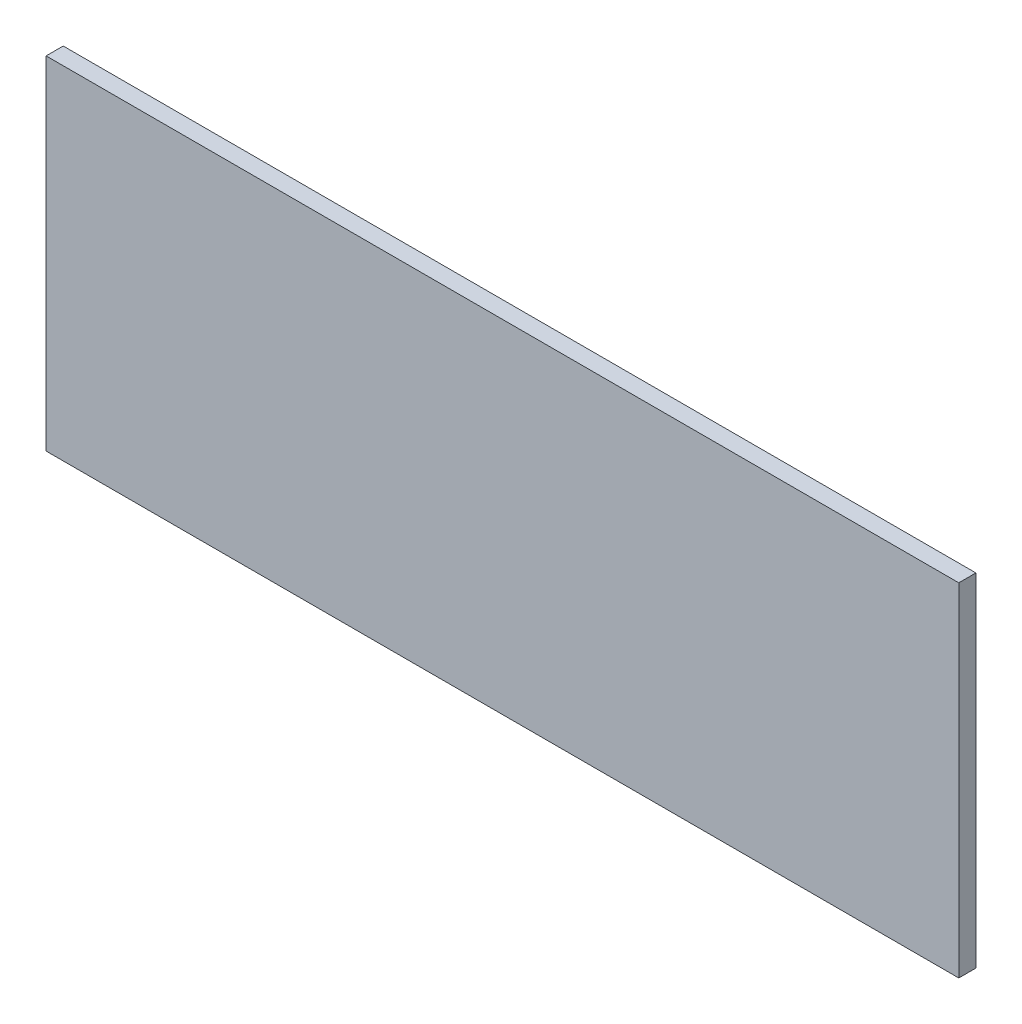
ISO-10303-21;
HEADER;
FILE_DESCRIPTION(('STEP AP214'),'2;1');
FILE_NAME('part.step','',(''),(''),'','','');
FILE_SCHEMA(('AUTOMOTIVE_DESIGN { 1 0 10303 214 1 1 1 1 }'));
ENDSEC;
DATA;
#1=APPLICATION_CONTEXT('core data for automotive mechanical design processes');
#2=APPLICATION_PROTOCOL_DEFINITION('international standard','automotive_design',2000,#1);
#3=PRODUCT_CONTEXT('',#1,'mechanical');
#4=PRODUCT('Part','Part','',(#3));
#5=PRODUCT_RELATED_PRODUCT_CATEGORY('part','',(#4));
#6=PRODUCT_DEFINITION_FORMATION('','',#4);
#7=PRODUCT_DEFINITION_CONTEXT('part definition',#1,'design');
#8=PRODUCT_DEFINITION('design','',#6,#7);
#9=PRODUCT_DEFINITION_SHAPE('','',#8);
#10=(LENGTH_UNIT() NAMED_UNIT(*) SI_UNIT(.MILLI.,.METRE.));
#11=(NAMED_UNIT(*) PLANE_ANGLE_UNIT() SI_UNIT($,.RADIAN.));
#12=(NAMED_UNIT(*) SI_UNIT($,.STERADIAN.) SOLID_ANGLE_UNIT());
#13=UNCERTAINTY_MEASURE_WITH_UNIT(LENGTH_MEASURE(1.E-05),#10,'distance_accuracy_value','');
#14=(GEOMETRIC_REPRESENTATION_CONTEXT(3) GLOBAL_UNCERTAINTY_ASSIGNED_CONTEXT((#13)) GLOBAL_UNIT_ASSIGNED_CONTEXT((#10,
#11,#12)) REPRESENTATION_CONTEXT('',''));
#15=CARTESIAN_POINT('',(0.,0.,0.));
#16=DIRECTION('',(0.,0.,1.));
#17=DIRECTION('',(1.,0.,0.));
#18=AXIS2_PLACEMENT_3D('',#15,#16,#17);
#19=CARTESIAN_POINT('',(160.,-60.,6.));
#20=DIRECTION('',(-1.,0.,0.));
#21=DIRECTION('',(0.,0.,1.));
#22=AXIS2_PLACEMENT_3D('',#19,#20,#21);
#23=PLANE('',#22);
#24=DIRECTION('',(0.,1.,0.));
#25=VECTOR('',#24,1.);
#26=CARTESIAN_POINT('',(160.,-60.,0.));
#27=LINE('',#26,#25);
#28=CARTESIAN_POINT('',(160.,-60.,0.));
#29=VERTEX_POINT('',#28);
#30=CARTESIAN_POINT('',(160.,60.,0.));
#31=VERTEX_POINT('',#30);
#32=EDGE_CURVE('E97',#29,#31,#27,.T.);
#33=ORIENTED_EDGE('',*,*,#32,.T.);
#34=DIRECTION('',(0.,0.,-1.));
#35=VECTOR('',#34,1.);
#36=CARTESIAN_POINT('',(160.,60.,6.));
#37=LINE('',#36,#35);
#38=CARTESIAN_POINT('',(160.,60.,6.));
#39=VERTEX_POINT('',#38);
#40=EDGE_CURVE('E11',#39,#31,#37,.T.);
#41=ORIENTED_EDGE('',*,*,#40,.F.);
#42=DIRECTION('',(0.,1.,0.));
#43=VECTOR('',#42,1.);
#44=CARTESIAN_POINT('',(160.,-60.,6.));
#45=LINE('',#44,#43);
#46=CARTESIAN_POINT('',(160.,-60.,6.));
#47=VERTEX_POINT('',#46);
#48=EDGE_CURVE('E85',#47,#39,#45,.T.);
#49=ORIENTED_EDGE('',*,*,#48,.F.);
#50=DIRECTION('',(0.,0.,-1.));
#51=VECTOR('',#50,1.);
#52=CARTESIAN_POINT('',(160.,-60.,6.));
#53=LINE('',#52,#51);
#54=EDGE_CURVE('E93',#47,#29,#53,.T.);
#55=ORIENTED_EDGE('',*,*,#54,.T.);
#56=EDGE_LOOP('',(#33,#41,#49,#55));
#57=FACE_BOUND('',#56,.T.);
#58=ADVANCED_FACE('F34',(#57),#23,.F.);
#59=CARTESIAN_POINT('',(-160.,60.,6.));
#60=DIRECTION('',(0.,-1.,0.));
#61=DIRECTION('',(0.,0.,-1.));
#62=AXIS2_PLACEMENT_3D('',#59,#60,#61);
#63=PLANE('',#62);
#64=DIRECTION('',(-1.,0.,0.));
#65=VECTOR('',#64,1.);
#66=CARTESIAN_POINT('',(-160.,60.,0.));
#67=LINE('',#66,#65);
#68=CARTESIAN_POINT('',(-160.,60.,0.));
#69=VERTEX_POINT('',#68);
#70=EDGE_CURVE('E89',#31,#69,#67,.T.);
#71=ORIENTED_EDGE('',*,*,#70,.T.);
#72=DIRECTION('',(0.,0.,-1.));
#73=VECTOR('',#72,1.);
#74=CARTESIAN_POINT('',(-160.,60.,6.));
#75=LINE('',#74,#73);
#76=CARTESIAN_POINT('',(-160.,60.,6.));
#77=VERTEX_POINT('',#76);
#78=EDGE_CURVE('E42',#77,#69,#75,.T.);
#79=ORIENTED_EDGE('',*,*,#78,.F.);
#80=DIRECTION('',(-1.,0.,0.));
#81=VECTOR('',#80,1.);
#82=CARTESIAN_POINT('',(-160.,60.,6.));
#83=LINE('',#82,#81);
#84=EDGE_CURVE('E80',#39,#77,#83,.T.);
#85=ORIENTED_EDGE('',*,*,#84,.F.);
#86=ORIENTED_EDGE('',*,*,#40,.T.);
#87=EDGE_LOOP('',(#71,#79,#85,#86));
#88=FACE_BOUND('',#87,.T.);
#89=ADVANCED_FACE('F88',(#88),#63,.F.);
#90=CARTESIAN_POINT('',(-160.,-60.,6.));
#91=DIRECTION('',(1.,0.,0.));
#92=DIRECTION('',(0.,0.,-1.));
#93=AXIS2_PLACEMENT_3D('',#90,#91,#92);
#94=PLANE('',#93);
#95=DIRECTION('',(0.,-1.,0.));
#96=VECTOR('',#95,1.);
#97=CARTESIAN_POINT('',(-160.,-60.,0.));
#98=LINE('',#97,#96);
#99=CARTESIAN_POINT('',(-160.,-60.,0.));
#100=VERTEX_POINT('',#99);
#101=EDGE_CURVE('E67',#69,#100,#98,.T.);
#102=ORIENTED_EDGE('',*,*,#101,.T.);
#103=DIRECTION('',(0.,0.,-1.));
#104=VECTOR('',#103,1.);
#105=CARTESIAN_POINT('',(-160.,-60.,6.));
#106=LINE('',#105,#104);
#107=CARTESIAN_POINT('',(-160.,-60.,6.));
#108=VERTEX_POINT('',#107);
#109=EDGE_CURVE('E90',#108,#100,#106,.T.);
#110=ORIENTED_EDGE('',*,*,#109,.F.);
#111=DIRECTION('',(0.,-1.,0.));
#112=VECTOR('',#111,1.);
#113=CARTESIAN_POINT('',(-160.,-60.,6.));
#114=LINE('',#113,#112);
#115=EDGE_CURVE('E83',#77,#108,#114,.T.);
#116=ORIENTED_EDGE('',*,*,#115,.F.);
#117=ORIENTED_EDGE('',*,*,#78,.T.);
#118=EDGE_LOOP('',(#102,#110,#116,#117));
#119=FACE_BOUND('',#118,.T.);
#120=ADVANCED_FACE('F91',(#119),#94,.F.);
#121=CARTESIAN_POINT('',(-160.,-60.,6.));
#122=DIRECTION('',(0.,1.,0.));
#123=DIRECTION('',(0.,0.,1.));
#124=AXIS2_PLACEMENT_3D('',#121,#122,#123);
#125=PLANE('',#124);
#126=DIRECTION('',(1.,0.,0.));
#127=VECTOR('',#126,1.);
#128=CARTESIAN_POINT('',(-160.,-60.,0.));
#129=LINE('',#128,#127);
#130=EDGE_CURVE('E73',#100,#29,#129,.T.);
#131=ORIENTED_EDGE('',*,*,#130,.T.);
#132=ORIENTED_EDGE('',*,*,#54,.F.);
#133=DIRECTION('',(1.,0.,0.));
#134=VECTOR('',#133,1.);
#135=CARTESIAN_POINT('',(-160.,-60.,6.));
#136=LINE('',#135,#134);
#137=EDGE_CURVE('E50',#108,#47,#136,.T.);
#138=ORIENTED_EDGE('',*,*,#137,.F.);
#139=ORIENTED_EDGE('',*,*,#109,.T.);
#140=EDGE_LOOP('',(#131,#132,#138,#139));
#141=FACE_BOUND('',#140,.T.);
#142=ADVANCED_FACE('F104',(#141),#125,.F.);
#143=CARTESIAN_POINT('',(0.,0.,6.));
#144=DIRECTION('',(0.,0.,-1.));
#145=DIRECTION('',(-1.,0.,0.));
#146=AXIS2_PLACEMENT_3D('',#143,#144,#145);
#147=PLANE('',#146);
#148=ORIENTED_EDGE('',*,*,#48,.T.);
#149=ORIENTED_EDGE('',*,*,#84,.T.);
#150=ORIENTED_EDGE('',*,*,#115,.T.);
#151=ORIENTED_EDGE('',*,*,#137,.T.);
#152=EDGE_LOOP('',(#148,#149,#150,#151));
#153=FACE_BOUND('',#152,.T.);
#154=ADVANCED_FACE('F81',(#153),#147,.F.);
#155=CARTESIAN_POINT('',(0.,0.,0.));
#156=DIRECTION('',(0.,0.,-1.));
#157=DIRECTION('',(-1.,0.,0.));
#158=AXIS2_PLACEMENT_3D('',#155,#156,#157);
#159=PLANE('',#158);
#160=ORIENTED_EDGE('',*,*,#32,.F.);
#161=ORIENTED_EDGE('',*,*,#130,.F.);
#162=ORIENTED_EDGE('',*,*,#101,.F.);
#163=ORIENTED_EDGE('',*,*,#70,.F.);
#164=EDGE_LOOP('',(#160,#161,#162,#163));
#165=FACE_BOUND('',#164,.T.);
#166=ADVANCED_FACE('F107',(#165),#159,.T.);
#167=CLOSED_SHELL('',(#58,#89,#120,#142,#154,#166));
#168=MANIFOLD_SOLID_BREP('B2',#167);
#169=ADVANCED_BREP_SHAPE_REPRESENTATION('',(#18,#168),#14);
#170=SHAPE_DEFINITION_REPRESENTATION(#9,#169);
ENDSEC;
END-ISO-10303-21;
